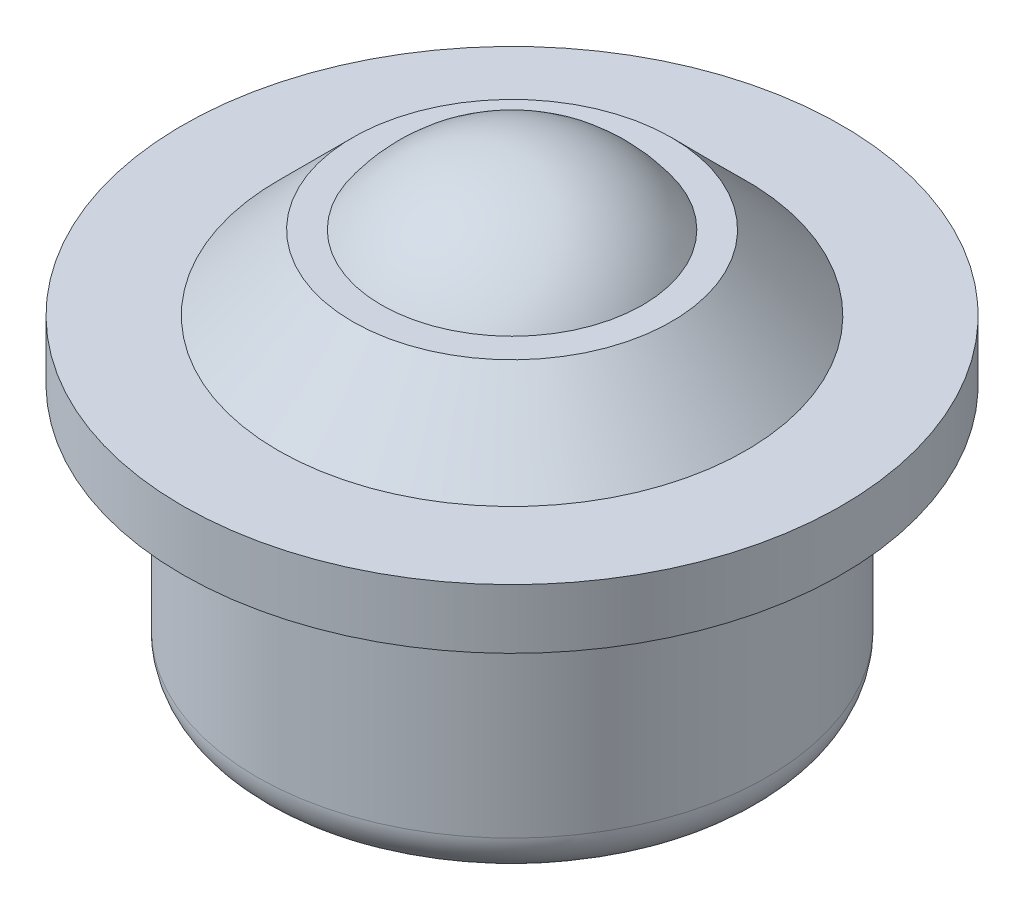
ISO-10303-21;
HEADER;
FILE_DESCRIPTION(('STEP AP214'),'2;1');
FILE_NAME('part.step','',(''),(''),'','','');
FILE_SCHEMA(('AUTOMOTIVE_DESIGN { 1 0 10303 214 1 1 1 1 }'));
ENDSEC;
DATA;
#1=APPLICATION_CONTEXT('core data for automotive mechanical design processes');
#2=APPLICATION_PROTOCOL_DEFINITION('international standard','automotive_design',2000,#1);
#3=PRODUCT_CONTEXT('',#1,'mechanical');
#4=PRODUCT('Part','Part','',(#3));
#5=PRODUCT_RELATED_PRODUCT_CATEGORY('part','',(#4));
#6=PRODUCT_DEFINITION_FORMATION('','',#4);
#7=PRODUCT_DEFINITION_CONTEXT('part definition',#1,'design');
#8=PRODUCT_DEFINITION('design','',#6,#7);
#9=PRODUCT_DEFINITION_SHAPE('','',#8);
#10=(LENGTH_UNIT() NAMED_UNIT(*) SI_UNIT(.MILLI.,.METRE.));
#11=(NAMED_UNIT(*) PLANE_ANGLE_UNIT() SI_UNIT($,.RADIAN.));
#12=(NAMED_UNIT(*) SI_UNIT($,.STERADIAN.) SOLID_ANGLE_UNIT());
#13=UNCERTAINTY_MEASURE_WITH_UNIT(LENGTH_MEASURE(1.E-05),#10,'distance_accuracy_value','');
#14=(GEOMETRIC_REPRESENTATION_CONTEXT(3) GLOBAL_UNCERTAINTY_ASSIGNED_CONTEXT((#13)) GLOBAL_UNIT_ASSIGNED_CONTEXT((#10,
#11,#12)) REPRESENTATION_CONTEXT('',''));
#15=CARTESIAN_POINT('',(0.,0.,0.));
#16=DIRECTION('',(0.,0.,1.));
#17=DIRECTION('',(1.,0.,0.));
#18=AXIS2_PLACEMENT_3D('',#15,#16,#17);
#19=CARTESIAN_POINT('',(0.,-12.,0.));
#20=DIRECTION('',(0.,1.,0.));
#21=DIRECTION('',(0.,0.,1.));
#22=AXIS2_PLACEMENT_3D('',#19,#20,#21);
#23=TOROIDAL_SURFACE('',#22,10.,2.);
#24=CARTESIAN_POINT('',(0.,-13.230532376721,0.));
#25=DIRECTION('',(0.,1.,0.));
#26=DIRECTION('',(0.,0.,1.));
#27=AXIS2_PLACEMENT_3D('',#24,#25,#26);
#28=CIRCLE('',#27,8.42336114793482);
#29=CARTESIAN_POINT('',(0.,-13.230532376721,8.42336114793482));
#30=VERTEX_POINT('',#29);
#31=EDGE_CURVE('E10',#30,#30,#28,.T.);
#32=ORIENTED_EDGE('',*,*,#31,.T.);
#33=EDGE_LOOP('',(#32));
#34=FACE_BOUND('',#33,.T.);
#35=CARTESIAN_POINT('',(0.,-12.,0.));
#36=DIRECTION('',(0.,1.,0.));
#37=DIRECTION('',(0.,0.,1.));
#38=AXIS2_PLACEMENT_3D('',#35,#36,#37);
#39=CIRCLE('',#38,12.);
#40=CARTESIAN_POINT('',(0.,-12.,12.));
#41=VERTEX_POINT('',#40);
#42=EDGE_CURVE('E65',#41,#41,#39,.T.);
#43=ORIENTED_EDGE('',*,*,#42,.F.);
#44=EDGE_LOOP('',(#43));
#45=FACE_BOUND('',#44,.T.);
#46=ADVANCED_FACE('F34',(#34,#45),#23,.T.);
#47=CARTESIAN_POINT('',(0.,-14.461064753442,0.));
#48=DIRECTION('',(0.,1.,0.));
#49=DIRECTION('',(0.,0.,1.));
#50=AXIS2_PLACEMENT_3D('',#47,#48,#49);
#51=TOROIDAL_SURFACE('',#50,6.84672229586964,2.);
#52=CARTESIAN_POINT('',(0.,-12.6534316592617,0.));
#53=DIRECTION('',(0.,1.,0.));
#54=DIRECTION('',(0.,0.,1.));
#55=AXIS2_PLACEMENT_3D('',#52,#53,#54);
#56=CIRCLE('',#55,5.99088200888594);
#57=CARTESIAN_POINT('',(0.,-12.6534316592617,5.99088200888594));
#58=VERTEX_POINT('',#57);
#59=EDGE_CURVE('E40',#58,#58,#56,.T.);
#60=ORIENTED_EDGE('',*,*,#59,.T.);
#61=EDGE_LOOP('',(#60));
#62=FACE_BOUND('',#61,.T.);
#63=ORIENTED_EDGE('',*,*,#31,.F.);
#64=EDGE_LOOP('',(#63));
#65=FACE_BOUND('',#64,.T.);
#66=ADVANCED_FACE('F73',(#62,#65),#51,.F.);
#67=CARTESIAN_POINT('',(0.,0.,0.));
#68=DIRECTION('',(0.,1.,0.));
#69=DIRECTION('',(-1.,0.,0.));
#70=AXIS2_PLACEMENT_3D('',#67,#68,#69);
#71=SPHERICAL_SURFACE('',#70,14.);
#72=ORIENTED_EDGE('',*,*,#59,.F.);
#73=EDGE_LOOP('',(#72));
#74=FACE_BOUND('',#73,.T.);
#75=ADVANCED_FACE('F77',(#74),#71,.T.);
#76=CARTESIAN_POINT('',(0.,0.,0.));
#77=DIRECTION('',(0.,1.,0.));
#78=DIRECTION('',(1.,0.,0.));
#79=AXIS2_PLACEMENT_3D('',#76,#77,#78);
#80=SPHERICAL_SURFACE('',#79,7.5);
#81=CARTESIAN_POINT('',(0.,4.3,0.));
#82=DIRECTION('',(0.,1.,0.));
#83=DIRECTION('',(0.,0.,1.));
#84=AXIS2_PLACEMENT_3D('',#81,#82,#83);
#85=CIRCLE('',#84,6.14491659829489);
#86=CARTESIAN_POINT('',(0.,4.3,6.14491659829489));
#87=VERTEX_POINT('',#86);
#88=EDGE_CURVE('E44',#87,#87,#85,.T.);
#89=ORIENTED_EDGE('',*,*,#88,.T.);
#90=EDGE_LOOP('',(#89));
#91=FACE_BOUND('',#90,.T.);
#92=ADVANCED_FACE('F81',(#91),#80,.T.);
#93=CARTESIAN_POINT('',(-6.14491659829489,4.3,0.));
#94=DIRECTION('',(0.,1.,0.));
#95=DIRECTION('',(0.,0.,1.));
#96=AXIS2_PLACEMENT_3D('',#93,#94,#95);
#97=PLANE('',#96);
#98=CARTESIAN_POINT('',(0.,4.3,0.));
#99=DIRECTION('',(0.,1.,0.));
#100=DIRECTION('',(0.,0.,1.));
#101=AXIS2_PLACEMENT_3D('',#98,#99,#100);
#102=CIRCLE('',#101,7.50000000000001);
#103=CARTESIAN_POINT('',(0.,4.3,7.50000000000001));
#104=VERTEX_POINT('',#103);
#105=EDGE_CURVE('E48',#104,#104,#102,.T.);
#106=ORIENTED_EDGE('',*,*,#105,.T.);
#107=EDGE_LOOP('',(#106));
#108=FACE_BOUND('',#107,.T.);
#109=ORIENTED_EDGE('',*,*,#88,.F.);
#110=EDGE_LOOP('',(#109));
#111=FACE_BOUND('',#110,.T.);
#112=ADVANCED_FACE('F88',(#108,#111),#97,.T.);
#113=CARTESIAN_POINT('',(0.,4.3,0.));
#114=DIRECTION('',(0.,-1.,0.));
#115=DIRECTION('',(0.,0.,-1.));
#116=AXIS2_PLACEMENT_3D('',#113,#114,#115);
#117=CONICAL_SURFACE('',#116,7.50000000000001,0.785398163397446);
#118=CARTESIAN_POINT('',(0.,0.799999999999999,0.));
#119=DIRECTION('',(0.,1.,0.));
#120=DIRECTION('',(0.,0.,1.));
#121=AXIS2_PLACEMENT_3D('',#118,#119,#120);
#122=CIRCLE('',#121,11.);
#123=CARTESIAN_POINT('',(0.,0.799999999999999,11.));
#124=VERTEX_POINT('',#123);
#125=EDGE_CURVE('E53',#124,#124,#122,.T.);
#126=ORIENTED_EDGE('',*,*,#125,.T.);
#127=EDGE_LOOP('',(#126));
#128=FACE_BOUND('',#127,.T.);
#129=ORIENTED_EDGE('',*,*,#105,.F.);
#130=EDGE_LOOP('',(#129));
#131=FACE_BOUND('',#130,.T.);
#132=ADVANCED_FACE('F92',(#128,#131),#117,.T.);
#133=CARTESIAN_POINT('',(-11.,0.799999999999999,0.));
#134=DIRECTION('',(0.,1.,0.));
#135=DIRECTION('',(0.,0.,1.));
#136=AXIS2_PLACEMENT_3D('',#133,#134,#135);
#137=PLANE('',#136);
#138=CARTESIAN_POINT('',(0.,0.799999999999999,0.));
#139=DIRECTION('',(0.,1.,0.));
#140=DIRECTION('',(0.,0.,1.));
#141=AXIS2_PLACEMENT_3D('',#138,#139,#140);
#142=CIRCLE('',#141,15.5);
#143=CARTESIAN_POINT('',(0.,0.799999999999999,15.5));
#144=VERTEX_POINT('',#143);
#145=EDGE_CURVE('E56',#144,#144,#142,.T.);
#146=ORIENTED_EDGE('',*,*,#145,.T.);
#147=EDGE_LOOP('',(#146));
#148=FACE_BOUND('',#147,.T.);
#149=ORIENTED_EDGE('',*,*,#125,.F.);
#150=EDGE_LOOP('',(#149));
#151=FACE_BOUND('',#150,.T.);
#152=ADVANCED_FACE('F96',(#148,#151),#137,.T.);
#153=CARTESIAN_POINT('',(0.,7.5,0.));
#154=DIRECTION('',(0.,1.,0.));
#155=DIRECTION('',(0.,0.,1.));
#156=AXIS2_PLACEMENT_3D('',#153,#154,#155);
#157=CYLINDRICAL_SURFACE('',#156,15.5);
#158=CARTESIAN_POINT('',(0.,-1.99999999999999,0.));
#159=DIRECTION('',(0.,1.,0.));
#160=DIRECTION('',(0.,0.,1.));
#161=AXIS2_PLACEMENT_3D('',#158,#159,#160);
#162=CIRCLE('',#161,15.5);
#163=CARTESIAN_POINT('',(0.,-1.99999999999999,15.5));
#164=VERTEX_POINT('',#163);
#165=EDGE_CURVE('E59',#164,#164,#162,.T.);
#166=ORIENTED_EDGE('',*,*,#165,.T.);
#167=EDGE_LOOP('',(#166));
#168=FACE_BOUND('',#167,.T.);
#169=ORIENTED_EDGE('',*,*,#145,.F.);
#170=EDGE_LOOP('',(#169));
#171=FACE_BOUND('',#170,.T.);
#172=ADVANCED_FACE('F100',(#168,#171),#157,.T.);
#173=CARTESIAN_POINT('',(-12.,-2.,0.));
#174=DIRECTION('',(0.,-1.,0.));
#175=DIRECTION('',(0.,0.,-1.));
#176=AXIS2_PLACEMENT_3D('',#173,#174,#175);
#177=PLANE('',#176);
#178=CARTESIAN_POINT('',(0.,-1.99999999999999,0.));
#179=DIRECTION('',(0.,1.,0.));
#180=DIRECTION('',(0.,0.,1.));
#181=AXIS2_PLACEMENT_3D('',#178,#179,#180);
#182=CIRCLE('',#181,12.);
#183=CARTESIAN_POINT('',(0.,-1.99999999999999,12.));
#184=VERTEX_POINT('',#183);
#185=EDGE_CURVE('E62',#184,#184,#182,.T.);
#186=ORIENTED_EDGE('',*,*,#185,.T.);
#187=EDGE_LOOP('',(#186));
#188=FACE_BOUND('',#187,.T.);
#189=ORIENTED_EDGE('',*,*,#165,.F.);
#190=EDGE_LOOP('',(#189));
#191=FACE_BOUND('',#190,.T.);
#192=ADVANCED_FACE('F104',(#188,#191),#177,.T.);
#193=CARTESIAN_POINT('',(0.,7.5,0.));
#194=DIRECTION('',(0.,1.,0.));
#195=DIRECTION('',(0.,0.,1.));
#196=AXIS2_PLACEMENT_3D('',#193,#194,#195);
#197=CYLINDRICAL_SURFACE('',#196,12.);
#198=ORIENTED_EDGE('',*,*,#42,.T.);
#199=EDGE_LOOP('',(#198));
#200=FACE_BOUND('',#199,.T.);
#201=ORIENTED_EDGE('',*,*,#185,.F.);
#202=EDGE_LOOP('',(#201));
#203=FACE_BOUND('',#202,.T.);
#204=ADVANCED_FACE('F69',(#200,#203),#197,.T.);
#205=CLOSED_SHELL('',(#46,#66,#75,#92,#112,#132,#152,#172,#192,#204));
#206=MANIFOLD_SOLID_BREP('B2',#205);
#207=ADVANCED_BREP_SHAPE_REPRESENTATION('',(#18,#206),#14);
#208=SHAPE_DEFINITION_REPRESENTATION(#9,#207);
ENDSEC;
END-ISO-10303-21;
